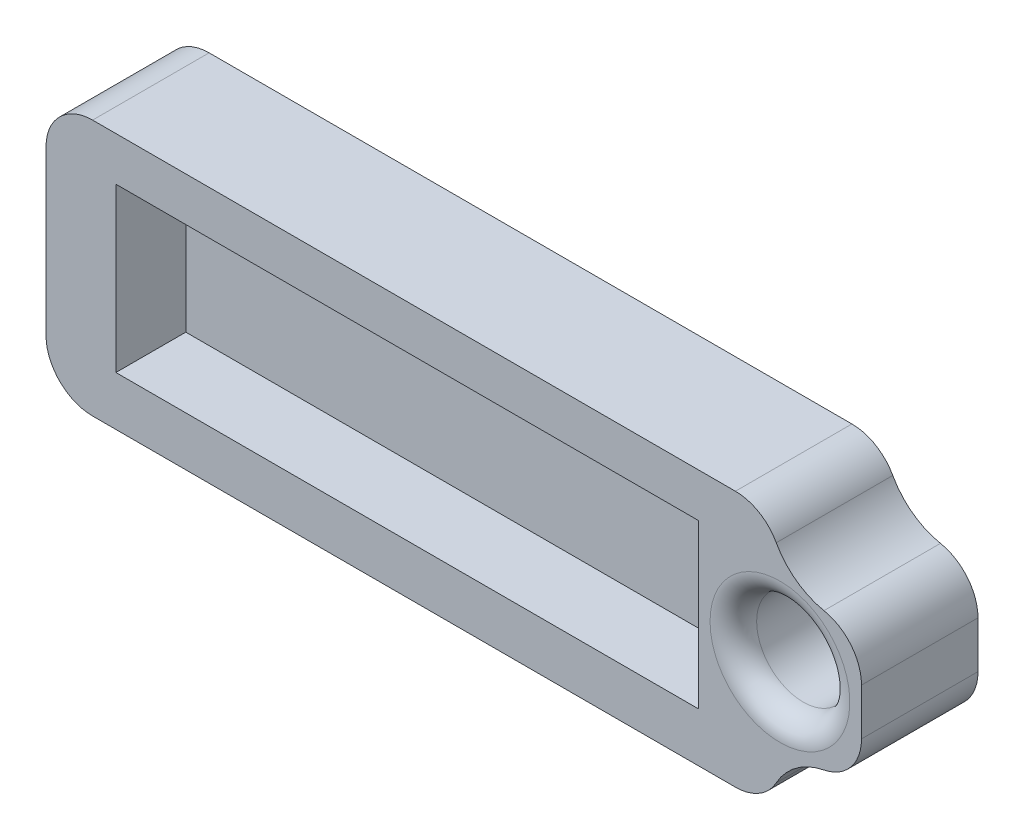
ISO-10303-21;
HEADER;
FILE_DESCRIPTION(('STEP AP214'),'2;1');
FILE_NAME('part.step','',(''),(''),'','','');
FILE_SCHEMA(('AUTOMOTIVE_DESIGN { 1 0 10303 214 1 1 1 1 }'));
ENDSEC;
DATA;
#1=APPLICATION_CONTEXT('core data for automotive mechanical design processes');
#2=APPLICATION_PROTOCOL_DEFINITION('international standard','automotive_design',2000,#1);
#3=PRODUCT_CONTEXT('',#1,'mechanical');
#4=PRODUCT('Part','Part','',(#3));
#5=PRODUCT_RELATED_PRODUCT_CATEGORY('part','',(#4));
#6=PRODUCT_DEFINITION_FORMATION('','',#4);
#7=PRODUCT_DEFINITION_CONTEXT('part definition',#1,'design');
#8=PRODUCT_DEFINITION('design','',#6,#7);
#9=PRODUCT_DEFINITION_SHAPE('','',#8);
#10=(LENGTH_UNIT() NAMED_UNIT(*) SI_UNIT(.MILLI.,.METRE.));
#11=(NAMED_UNIT(*) PLANE_ANGLE_UNIT() SI_UNIT($,.RADIAN.));
#12=(NAMED_UNIT(*) SI_UNIT($,.STERADIAN.) SOLID_ANGLE_UNIT());
#13=UNCERTAINTY_MEASURE_WITH_UNIT(LENGTH_MEASURE(1.E-05),#10,'distance_accuracy_value','');
#14=(GEOMETRIC_REPRESENTATION_CONTEXT(3) GLOBAL_UNCERTAINTY_ASSIGNED_CONTEXT((#13)) GLOBAL_UNIT_ASSIGNED_CONTEXT((#10,
#11,#12)) REPRESENTATION_CONTEXT('',''));
#15=CARTESIAN_POINT('',(0.,0.,0.));
#16=DIRECTION('',(0.,0.,1.));
#17=DIRECTION('',(1.,0.,0.));
#18=AXIS2_PLACEMENT_3D('',#15,#16,#17);
#19=CARTESIAN_POINT('',(-48.0962896326296,11.,-18.146412089834));
#20=DIRECTION('',(1.,0.,0.));
#21=DIRECTION('',(0.,0.,-1.));
#22=AXIS2_PLACEMENT_3D('',#19,#20,#21);
#23=PLANE('',#22);
#24=DIRECTION('',(0.,-1.,0.));
#25=VECTOR('',#24,1.);
#26=CARTESIAN_POINT('',(-48.0962896326296,11.,-18.146412089834));
#27=LINE('',#26,#25);
#28=CARTESIAN_POINT('',(-48.0962896326296,9.,-18.146412089834));
#29=VERTEX_POINT('',#28);
#30=CARTESIAN_POINT('',(-48.0962896326296,2.,-18.146412089834));
#31=VERTEX_POINT('',#30);
#32=EDGE_CURVE('E201',#29,#31,#27,.T.);
#33=ORIENTED_EDGE('',*,*,#32,.T.);
#34=DIRECTION('',(0.,0.,1.));
#35=VECTOR('',#34,1.);
#36=CARTESIAN_POINT('',(-48.0962896326296,2.,-18.146412089834));
#37=LINE('',#36,#35);
#38=CARTESIAN_POINT('',(-48.0962896326296,2.,-13.146412089834));
#39=VERTEX_POINT('',#38);
#40=EDGE_CURVE('E11',#31,#39,#37,.T.);
#41=ORIENTED_EDGE('',*,*,#40,.T.);
#42=DIRECTION('',(0.,-1.,0.));
#43=VECTOR('',#42,1.);
#44=CARTESIAN_POINT('',(-48.0962896326296,11.,-13.146412089834));
#45=LINE('',#44,#43);
#46=CARTESIAN_POINT('',(-48.0962896326296,9.,-13.146412089834));
#47=VERTEX_POINT('',#46);
#48=EDGE_CURVE('E207',#47,#39,#45,.T.);
#49=ORIENTED_EDGE('',*,*,#48,.F.);
#50=DIRECTION('',(0.,0.,1.));
#51=VECTOR('',#50,1.);
#52=CARTESIAN_POINT('',(-48.0962896326296,9.,-18.146412089834));
#53=LINE('',#52,#51);
#54=EDGE_CURVE('E41',#47,#29,#53,.F.);
#55=ORIENTED_EDGE('',*,*,#54,.T.);
#56=EDGE_LOOP('',(#33,#41,#49,#55));
#57=FACE_BOUND('',#56,.T.);
#58=ADVANCED_FACE('F33',(#57),#23,.F.);
#59=CARTESIAN_POINT('',(-48.0962896326296,11.,-13.146412089834));
#60=DIRECTION('',(0.,0.,-1.));
#61=DIRECTION('',(-1.,0.,0.));
#62=AXIS2_PLACEMENT_3D('',#59,#60,#61);
#63=PLANE('',#62);
#64=CARTESIAN_POINT('',(-16.5962896326296,5.61752243020169,-13.146412089834));
#65=DIRECTION('',(0.,0.,-1.));
#66=DIRECTION('',(-1.,0.,0.));
#67=AXIS2_PLACEMENT_3D('',#64,#65,#66);
#68=CIRCLE('',#67,3.);
#69=CARTESIAN_POINT('',(-19.5962896326296,5.61752243020169,-13.146412089834));
#70=VERTEX_POINT('',#69);
#71=EDGE_CURVE('E219',#70,#70,#68,.T.);
#72=ORIENTED_EDGE('',*,*,#71,.T.);
#73=EDGE_LOOP('',(#72));
#74=FACE_BOUND('',#73,.T.);
#75=DIRECTION('',(1.,0.,0.));
#76=VECTOR('',#75,1.);
#77=CARTESIAN_POINT('',(-20.0962896326296,2.11752243020169,-13.146412089834));
#78=LINE('',#77,#76);
#79=CARTESIAN_POINT('',(-45.0962896326296,2.11752243020169,-13.146412089834));
#80=VERTEX_POINT('',#79);
#81=CARTESIAN_POINT('',(-20.0962896326296,2.11752243020169,-13.146412089834));
#82=VERTEX_POINT('',#81);
#83=EDGE_CURVE('E184',#80,#82,#78,.T.);
#84=ORIENTED_EDGE('',*,*,#83,.F.);
#85=DIRECTION('',(0.,-1.,0.));
#86=VECTOR('',#85,1.);
#87=CARTESIAN_POINT('',(-45.0962896326296,2.11752243020169,-13.146412089834));
#88=LINE('',#87,#86);
#89=CARTESIAN_POINT('',(-45.0962896326296,9.11752243020169,-13.146412089834));
#90=VERTEX_POINT('',#89);
#91=EDGE_CURVE('E155',#90,#80,#88,.T.);
#92=ORIENTED_EDGE('',*,*,#91,.F.);
#93=DIRECTION('',(-1.,0.,0.));
#94=VECTOR('',#93,1.);
#95=CARTESIAN_POINT('',(-20.0962896326296,9.11752243020169,-13.146412089834));
#96=LINE('',#95,#94);
#97=CARTESIAN_POINT('',(-20.0962896326296,9.11752243020169,-13.146412089834));
#98=VERTEX_POINT('',#97);
#99=EDGE_CURVE('E172',#98,#90,#96,.T.);
#100=ORIENTED_EDGE('',*,*,#99,.F.);
#101=DIRECTION('',(0.,1.,0.));
#102=VECTOR('',#101,1.);
#103=CARTESIAN_POINT('',(-20.0962896326296,2.11752243020169,-13.146412089834));
#104=LINE('',#103,#102);
#105=EDGE_CURVE('E175',#82,#98,#104,.T.);
#106=ORIENTED_EDGE('',*,*,#105,.F.);
#107=EDGE_LOOP('',(#84,#92,#100,#106));
#108=FACE_BOUND('',#107,.T.);
#109=CARTESIAN_POINT('',(-14.1236836087987,11.4044915661471,-13.146412089834));
#110=DIRECTION('',(0.,0.,-1.));
#111=DIRECTION('',(-1.,0.,0.));
#112=AXIS2_PLACEMENT_3D('',#109,#110,#111);
#113=CIRCLE('',#112,3.);
#114=CARTESIAN_POINT('',(-14.7072472230972,8.46179662645883,-13.146412089834));
#115=VERTEX_POINT('',#114);
#116=CARTESIAN_POINT('',(-16.7540127347823,9.96179662645883,-13.146412089834));
#117=VERTEX_POINT('',#116);
#118=EDGE_CURVE('E244',#115,#117,#113,.T.);
#119=ORIENTED_EDGE('',*,*,#118,.T.);
#120=CARTESIAN_POINT('',(-18.5075654854381,9.,-13.146412089834));
#121=DIRECTION('',(0.,0.,-1.));
#122=DIRECTION('',(-1.,0.,0.));
#123=AXIS2_PLACEMENT_3D('',#120,#121,#122);
#124=CIRCLE('',#123,2.);
#125=CARTESIAN_POINT('',(-18.5075654854381,11.,-13.146412089834));
#126=VERTEX_POINT('',#125);
#127=EDGE_CURVE('E275',#117,#126,#124,.F.);
#128=ORIENTED_EDGE('',*,*,#127,.T.);
#129=DIRECTION('',(1.,0.,0.));
#130=VECTOR('',#129,1.);
#131=CARTESIAN_POINT('',(-48.0962896326296,11.,-13.146412089834));
#132=LINE('',#131,#130);
#133=CARTESIAN_POINT('',(-46.0962896326296,11.,-13.146412089834));
#134=VERTEX_POINT('',#133);
#135=EDGE_CURVE('E194',#134,#126,#132,.T.);
#136=ORIENTED_EDGE('',*,*,#135,.F.);
#137=CARTESIAN_POINT('',(-46.0962896326296,9.,-13.146412089834));
#138=DIRECTION('',(0.,0.,-1.));
#139=DIRECTION('',(-1.,0.,0.));
#140=AXIS2_PLACEMENT_3D('',#137,#138,#139);
#141=CIRCLE('',#140,2.);
#142=EDGE_CURVE('E270',#134,#47,#141,.F.);
#143=ORIENTED_EDGE('',*,*,#142,.T.);
#144=ORIENTED_EDGE('',*,*,#48,.T.);
#145=CARTESIAN_POINT('',(-46.0962896326296,2.,-13.146412089834));
#146=DIRECTION('',(0.,0.,-1.));
#147=DIRECTION('',(-1.,0.,0.));
#148=AXIS2_PLACEMENT_3D('',#145,#146,#147);
#149=CIRCLE('',#148,2.);
#150=CARTESIAN_POINT('',(-46.0962896326296,0.,-13.146412089834));
#151=VERTEX_POINT('',#150);
#152=EDGE_CURVE('E272',#39,#151,#149,.F.);
#153=ORIENTED_EDGE('',*,*,#152,.T.);
#154=DIRECTION('',(1.,0.,0.));
#155=VECTOR('',#154,1.);
#156=CARTESIAN_POINT('',(-48.0962896326296,0.,-13.146412089834));
#157=LINE('',#156,#155);
#158=CARTESIAN_POINT('',(-18.5075654854381,0.,-13.146412089834));
#159=VERTEX_POINT('',#158);
#160=EDGE_CURVE('E190',#151,#159,#157,.T.);
#161=ORIENTED_EDGE('',*,*,#160,.T.);
#162=CARTESIAN_POINT('',(-18.5075654854381,2.,-13.146412089834));
#163=DIRECTION('',(0.,0.,-1.));
#164=DIRECTION('',(-1.,0.,0.));
#165=AXIS2_PLACEMENT_3D('',#162,#163,#164);
#166=CIRCLE('',#165,2.);
#167=CARTESIAN_POINT('',(-16.7540127347823,1.03820337354117,-13.146412089834));
#168=VERTEX_POINT('',#167);
#169=EDGE_CURVE('E48',#159,#168,#166,.F.);
#170=ORIENTED_EDGE('',*,*,#169,.T.);
#171=CARTESIAN_POINT('',(-14.1236836087987,-0.404491566147076,-13.146412089834));
#172=DIRECTION('',(0.,0.,-1.));
#173=DIRECTION('',(-1.,0.,0.));
#174=AXIS2_PLACEMENT_3D('',#171,#172,#173);
#175=CIRCLE('',#174,3.);
#176=CARTESIAN_POINT('',(-14.7072472230972,2.53820337354117,-13.146412089834));
#177=VERTEX_POINT('',#176);
#178=EDGE_CURVE('E252',#168,#177,#175,.T.);
#179=ORIENTED_EDGE('',*,*,#178,.T.);
#180=CARTESIAN_POINT('',(-15.0962896326296,4.5,-13.146412089834));
#181=DIRECTION('',(0.,0.,-1.));
#182=DIRECTION('',(-1.,0.,0.));
#183=AXIS2_PLACEMENT_3D('',#180,#181,#182);
#184=CIRCLE('',#183,2.);
#185=CARTESIAN_POINT('',(-13.0962896326296,4.5,-13.146412089834));
#186=VERTEX_POINT('',#185);
#187=EDGE_CURVE('E228',#177,#186,#184,.F.);
#188=ORIENTED_EDGE('',*,*,#187,.T.);
#189=DIRECTION('',(0.,-1.,0.));
#190=VECTOR('',#189,1.);
#191=CARTESIAN_POINT('',(-13.0962896326296,2.5,-13.146412089834));
#192=LINE('',#191,#190);
#193=CARTESIAN_POINT('',(-13.0962896326296,6.5,-13.146412089834));
#194=VERTEX_POINT('',#193);
#195=EDGE_CURVE('E313',#194,#186,#192,.T.);
#196=ORIENTED_EDGE('',*,*,#195,.F.);
#197=CARTESIAN_POINT('',(-15.0962896326296,6.5,-13.146412089834));
#198=DIRECTION('',(0.,0.,-1.));
#199=DIRECTION('',(-1.,0.,0.));
#200=AXIS2_PLACEMENT_3D('',#197,#198,#199);
#201=CIRCLE('',#200,2.);
#202=EDGE_CURVE('E230',#194,#115,#201,.F.);
#203=ORIENTED_EDGE('',*,*,#202,.T.);
#204=EDGE_LOOP('',(#119,#128,#136,#143,#144,#153,#161,#170,#179,#188,#196,#203));
#205=FACE_BOUND('',#204,.T.);
#206=ADVANCED_FACE('F298',(#74,#108,#205),#63,.F.);
#207=CARTESIAN_POINT('',(-48.0962896326296,11.,-18.146412089834));
#208=DIRECTION('',(0.,0.,1.));
#209=DIRECTION('',(1.,0.,0.));
#210=AXIS2_PLACEMENT_3D('',#207,#208,#209);
#211=PLANE('',#210);
#212=CARTESIAN_POINT('',(-16.5962896326296,5.61752243020169,-18.146412089834));
#213=DIRECTION('',(0.,0.,1.));
#214=DIRECTION('',(1.,0.,0.));
#215=AXIS2_PLACEMENT_3D('',#212,#213,#214);
#216=CIRCLE('',#215,3.);
#217=CARTESIAN_POINT('',(-13.5962896326296,5.61752243020169,-18.146412089834));
#218=VERTEX_POINT('',#217);
#219=EDGE_CURVE('E210',#218,#218,#216,.T.);
#220=ORIENTED_EDGE('',*,*,#219,.T.);
#221=EDGE_LOOP('',(#220));
#222=FACE_BOUND('',#221,.T.);
#223=DIRECTION('',(-1.,0.,0.));
#224=VECTOR('',#223,1.);
#225=CARTESIAN_POINT('',(-48.0962896326296,11.,-18.146412089834));
#226=LINE('',#225,#224);
#227=CARTESIAN_POINT('',(-18.5075654854381,11.,-18.146412089834));
#228=VERTEX_POINT('',#227);
#229=CARTESIAN_POINT('',(-46.0962896326296,11.,-18.146412089834));
#230=VERTEX_POINT('',#229);
#231=EDGE_CURVE('E197',#228,#230,#226,.T.);
#232=ORIENTED_EDGE('',*,*,#231,.F.);
#233=CARTESIAN_POINT('',(-18.5075654854381,9.,-18.146412089834));
#234=DIRECTION('',(0.,0.,1.));
#235=DIRECTION('',(1.,0.,0.));
#236=AXIS2_PLACEMENT_3D('',#233,#234,#235);
#237=CIRCLE('',#236,2.);
#238=CARTESIAN_POINT('',(-16.7540127347823,9.96179662645883,-18.146412089834));
#239=VERTEX_POINT('',#238);
#240=EDGE_CURVE('E266',#228,#239,#237,.F.);
#241=ORIENTED_EDGE('',*,*,#240,.T.);
#242=CARTESIAN_POINT('',(-14.1236836087987,11.4044915661471,-18.146412089834));
#243=DIRECTION('',(0.,0.,1.));
#244=DIRECTION('',(1.,0.,0.));
#245=AXIS2_PLACEMENT_3D('',#242,#243,#244);
#246=CIRCLE('',#245,3.);
#247=CARTESIAN_POINT('',(-14.7072472230972,8.46179662645883,-18.146412089834));
#248=VERTEX_POINT('',#247);
#249=EDGE_CURVE('E247',#239,#248,#246,.T.);
#250=ORIENTED_EDGE('',*,*,#249,.T.);
#251=CARTESIAN_POINT('',(-15.0962896326296,6.5,-18.146412089834));
#252=DIRECTION('',(0.,0.,1.));
#253=DIRECTION('',(1.,0.,0.));
#254=AXIS2_PLACEMENT_3D('',#251,#252,#253);
#255=CIRCLE('',#254,2.);
#256=CARTESIAN_POINT('',(-13.0962896326296,6.5,-18.146412089834));
#257=VERTEX_POINT('',#256);
#258=EDGE_CURVE('E236',#248,#257,#255,.F.);
#259=ORIENTED_EDGE('',*,*,#258,.T.);
#260=DIRECTION('',(0.,1.,0.));
#261=VECTOR('',#260,1.);
#262=CARTESIAN_POINT('',(-13.0962896326296,2.5,-18.146412089834));
#263=LINE('',#262,#261);
#264=CARTESIAN_POINT('',(-13.0962896326296,4.5,-18.146412089834));
#265=VERTEX_POINT('',#264);
#266=EDGE_CURVE('E178',#265,#257,#263,.T.);
#267=ORIENTED_EDGE('',*,*,#266,.F.);
#268=CARTESIAN_POINT('',(-15.0962896326296,4.5,-18.146412089834));
#269=DIRECTION('',(0.,0.,1.));
#270=DIRECTION('',(1.,0.,0.));
#271=AXIS2_PLACEMENT_3D('',#268,#269,#270);
#272=CIRCLE('',#271,2.);
#273=CARTESIAN_POINT('',(-14.7072472230972,2.53820337354117,-18.146412089834));
#274=VERTEX_POINT('',#273);
#275=EDGE_CURVE('E233',#265,#274,#272,.F.);
#276=ORIENTED_EDGE('',*,*,#275,.T.);
#277=CARTESIAN_POINT('',(-14.1236836087987,-0.404491566147076,-18.146412089834));
#278=DIRECTION('',(0.,0.,1.));
#279=DIRECTION('',(1.,0.,0.));
#280=AXIS2_PLACEMENT_3D('',#277,#278,#279);
#281=CIRCLE('',#280,3.);
#282=CARTESIAN_POINT('',(-16.7540127347823,1.03820337354117,-18.146412089834));
#283=VERTEX_POINT('',#282);
#284=EDGE_CURVE('E249',#274,#283,#281,.T.);
#285=ORIENTED_EDGE('',*,*,#284,.T.);
#286=CARTESIAN_POINT('',(-18.5075654854381,2.,-18.146412089834));
#287=DIRECTION('',(0.,0.,1.));
#288=DIRECTION('',(1.,0.,0.));
#289=AXIS2_PLACEMENT_3D('',#286,#287,#288);
#290=CIRCLE('',#289,2.);
#291=CARTESIAN_POINT('',(-18.5075654854381,0.,-18.146412089834));
#292=VERTEX_POINT('',#291);
#293=EDGE_CURVE('E264',#283,#292,#290,.F.);
#294=ORIENTED_EDGE('',*,*,#293,.T.);
#295=DIRECTION('',(-1.,0.,0.));
#296=VECTOR('',#295,1.);
#297=CARTESIAN_POINT('',(-48.0962896326296,0.,-18.146412089834));
#298=LINE('',#297,#296);
#299=CARTESIAN_POINT('',(-46.0962896326296,0.,-18.146412089834));
#300=VERTEX_POINT('',#299);
#301=EDGE_CURVE('E198',#292,#300,#298,.T.);
#302=ORIENTED_EDGE('',*,*,#301,.T.);
#303=CARTESIAN_POINT('',(-46.0962896326296,2.,-18.146412089834));
#304=DIRECTION('',(0.,0.,1.));
#305=DIRECTION('',(1.,0.,0.));
#306=AXIS2_PLACEMENT_3D('',#303,#304,#305);
#307=CIRCLE('',#306,2.);
#308=EDGE_CURVE('E262',#300,#31,#307,.F.);
#309=ORIENTED_EDGE('',*,*,#308,.T.);
#310=ORIENTED_EDGE('',*,*,#32,.F.);
#311=CARTESIAN_POINT('',(-46.0962896326296,9.,-18.146412089834));
#312=DIRECTION('',(0.,0.,1.));
#313=DIRECTION('',(1.,0.,0.));
#314=AXIS2_PLACEMENT_3D('',#311,#312,#313);
#315=CIRCLE('',#314,2.);
#316=EDGE_CURVE('E260',#29,#230,#315,.F.);
#317=ORIENTED_EDGE('',*,*,#316,.T.);
#318=EDGE_LOOP('',(#232,#241,#250,#259,#267,#276,#285,#294,#302,#309,#310,#317));
#319=FACE_BOUND('',#318,.T.);
#320=ADVANCED_FACE('F291',(#222,#319),#211,.F.);
#321=CARTESIAN_POINT('',(0.,11.,0.));
#322=DIRECTION('',(0.,1.,0.));
#323=DIRECTION('',(0.,0.,1.));
#324=AXIS2_PLACEMENT_3D('',#321,#322,#323);
#325=PLANE('',#324);
#326=ORIENTED_EDGE('',*,*,#135,.T.);
#327=DIRECTION('',(0.,0.,1.));
#328=VECTOR('',#327,1.);
#329=CARTESIAN_POINT('',(-18.5075654854381,11.,-18.146412089834));
#330=LINE('',#329,#328);
#331=EDGE_CURVE('E257',#126,#228,#330,.F.);
#332=ORIENTED_EDGE('',*,*,#331,.T.);
#333=ORIENTED_EDGE('',*,*,#231,.T.);
#334=DIRECTION('',(0.,0.,1.));
#335=VECTOR('',#334,1.);
#336=CARTESIAN_POINT('',(-46.0962896326296,11.,-13.146412089834));
#337=LINE('',#336,#335);
#338=EDGE_CURVE('E254',#230,#134,#337,.T.);
#339=ORIENTED_EDGE('',*,*,#338,.T.);
#340=EDGE_LOOP('',(#326,#332,#333,#339));
#341=FACE_BOUND('',#340,.T.);
#342=ADVANCED_FACE('F296',(#341),#325,.T.);
#343=CARTESIAN_POINT('',(0.,0.,0.));
#344=DIRECTION('',(0.,1.,0.));
#345=DIRECTION('',(0.,0.,1.));
#346=AXIS2_PLACEMENT_3D('',#343,#344,#345);
#347=PLANE('',#346);
#348=ORIENTED_EDGE('',*,*,#301,.F.);
#349=DIRECTION('',(0.,0.,1.));
#350=VECTOR('',#349,1.);
#351=CARTESIAN_POINT('',(-18.5075654854381,0.,0.));
#352=LINE('',#351,#350);
#353=EDGE_CURVE('E56',#292,#159,#352,.T.);
#354=ORIENTED_EDGE('',*,*,#353,.T.);
#355=ORIENTED_EDGE('',*,*,#160,.F.);
#356=DIRECTION('',(0.,0.,1.));
#357=VECTOR('',#356,1.);
#358=CARTESIAN_POINT('',(-46.0962896326296,0.,0.));
#359=LINE('',#358,#357);
#360=EDGE_CURVE('E280',#151,#300,#359,.F.);
#361=ORIENTED_EDGE('',*,*,#360,.T.);
#362=EDGE_LOOP('',(#348,#354,#355,#361));
#363=FACE_BOUND('',#362,.T.);
#364=ADVANCED_FACE('F328',(#363),#347,.F.);
#365=CARTESIAN_POINT('',(-45.0962896326296,2.11752243020169,-16.146412089834));
#366=DIRECTION('',(-1.,0.,0.));
#367=DIRECTION('',(0.,0.,1.));
#368=AXIS2_PLACEMENT_3D('',#365,#366,#367);
#369=PLANE('',#368);
#370=ORIENTED_EDGE('',*,*,#91,.T.);
#371=DIRECTION('',(0.,0.,1.));
#372=VECTOR('',#371,1.);
#373=CARTESIAN_POINT('',(-45.0962896326296,2.11752243020169,-16.146412089834));
#374=LINE('',#373,#372);
#375=CARTESIAN_POINT('',(-45.0962896326296,2.11752243020169,-16.146412089834));
#376=VERTEX_POINT('',#375);
#377=EDGE_CURVE('E148',#376,#80,#374,.T.);
#378=ORIENTED_EDGE('',*,*,#377,.F.);
#379=DIRECTION('',(0.,-1.,0.));
#380=VECTOR('',#379,1.);
#381=CARTESIAN_POINT('',(-45.0962896326296,2.11752243020169,-16.146412089834));
#382=LINE('',#381,#380);
#383=CARTESIAN_POINT('',(-45.0962896326296,9.11752243020169,-16.146412089834));
#384=VERTEX_POINT('',#383);
#385=EDGE_CURVE('E152',#384,#376,#382,.T.);
#386=ORIENTED_EDGE('',*,*,#385,.F.);
#387=DIRECTION('',(0.,0.,1.));
#388=VECTOR('',#387,1.);
#389=CARTESIAN_POINT('',(-45.0962896326296,9.11752243020169,-16.146412089834));
#390=LINE('',#389,#388);
#391=EDGE_CURVE('E188',#384,#90,#390,.T.);
#392=ORIENTED_EDGE('',*,*,#391,.T.);
#393=EDGE_LOOP('',(#370,#378,#386,#392));
#394=FACE_BOUND('',#393,.T.);
#395=ADVANCED_FACE('F150',(#394),#369,.F.);
#396=CARTESIAN_POINT('',(-20.0962896326296,9.11752243020169,-16.146412089834));
#397=DIRECTION('',(0.,1.,0.));
#398=DIRECTION('',(-1.,0.,0.));
#399=AXIS2_PLACEMENT_3D('',#396,#397,#398);
#400=PLANE('',#399);
#401=ORIENTED_EDGE('',*,*,#99,.T.);
#402=ORIENTED_EDGE('',*,*,#391,.F.);
#403=DIRECTION('',(-1.,0.,0.));
#404=VECTOR('',#403,1.);
#405=CARTESIAN_POINT('',(-20.0962896326296,9.11752243020169,-16.146412089834));
#406=LINE('',#405,#404);
#407=CARTESIAN_POINT('',(-20.0962896326296,9.11752243020169,-16.146412089834));
#408=VERTEX_POINT('',#407);
#409=EDGE_CURVE('E160',#408,#384,#406,.T.);
#410=ORIENTED_EDGE('',*,*,#409,.F.);
#411=DIRECTION('',(0.,0.,1.));
#412=VECTOR('',#411,1.);
#413=CARTESIAN_POINT('',(-20.0962896326296,9.11752243020169,-16.146412089834));
#414=LINE('',#413,#412);
#415=EDGE_CURVE('E191',#408,#98,#414,.T.);
#416=ORIENTED_EDGE('',*,*,#415,.T.);
#417=EDGE_LOOP('',(#401,#402,#410,#416));
#418=FACE_BOUND('',#417,.T.);
#419=ADVANCED_FACE('F476',(#418),#400,.F.);
#420=CARTESIAN_POINT('',(-20.0962896326296,2.11752243020169,-16.146412089834));
#421=DIRECTION('',(1.,0.,0.));
#422=DIRECTION('',(0.,0.,-1.));
#423=AXIS2_PLACEMENT_3D('',#420,#421,#422);
#424=PLANE('',#423);
#425=ORIENTED_EDGE('',*,*,#105,.T.);
#426=ORIENTED_EDGE('',*,*,#415,.F.);
#427=DIRECTION('',(0.,1.,0.));
#428=VECTOR('',#427,1.);
#429=CARTESIAN_POINT('',(-20.0962896326296,2.11752243020169,-16.146412089834));
#430=LINE('',#429,#428);
#431=CARTESIAN_POINT('',(-20.0962896326296,2.11752243020169,-16.146412089834));
#432=VERTEX_POINT('',#431);
#433=EDGE_CURVE('E168',#432,#408,#430,.T.);
#434=ORIENTED_EDGE('',*,*,#433,.F.);
#435=DIRECTION('',(0.,0.,1.));
#436=VECTOR('',#435,1.);
#437=CARTESIAN_POINT('',(-20.0962896326296,2.11752243020169,-16.146412089834));
#438=LINE('',#437,#436);
#439=EDGE_CURVE('E159',#432,#82,#438,.T.);
#440=ORIENTED_EDGE('',*,*,#439,.T.);
#441=EDGE_LOOP('',(#425,#426,#434,#440));
#442=FACE_BOUND('',#441,.T.);
#443=ADVANCED_FACE('F468',(#442),#424,.F.);
#444=CARTESIAN_POINT('',(-20.0962896326296,2.11752243020169,-16.146412089834));
#445=DIRECTION('',(0.,-1.,0.));
#446=DIRECTION('',(1.,0.,0.));
#447=AXIS2_PLACEMENT_3D('',#444,#445,#446);
#448=PLANE('',#447);
#449=ORIENTED_EDGE('',*,*,#83,.T.);
#450=ORIENTED_EDGE('',*,*,#439,.F.);
#451=DIRECTION('',(1.,0.,0.));
#452=VECTOR('',#451,1.);
#453=CARTESIAN_POINT('',(-20.0962896326296,2.11752243020169,-16.146412089834));
#454=LINE('',#453,#452);
#455=EDGE_CURVE('E163',#376,#432,#454,.T.);
#456=ORIENTED_EDGE('',*,*,#455,.F.);
#457=ORIENTED_EDGE('',*,*,#377,.T.);
#458=EDGE_LOOP('',(#449,#450,#456,#457));
#459=FACE_BOUND('',#458,.T.);
#460=ADVANCED_FACE('F164',(#459),#448,.F.);
#461=CARTESIAN_POINT('',(0.,0.,-16.146412089834));
#462=DIRECTION('',(0.,0.,1.));
#463=DIRECTION('',(1.,0.,0.));
#464=AXIS2_PLACEMENT_3D('',#461,#462,#463);
#465=PLANE('',#464);
#466=ORIENTED_EDGE('',*,*,#385,.T.);
#467=ORIENTED_EDGE('',*,*,#455,.T.);
#468=ORIENTED_EDGE('',*,*,#433,.T.);
#469=ORIENTED_EDGE('',*,*,#409,.T.);
#470=EDGE_LOOP('',(#466,#467,#468,#469));
#471=FACE_BOUND('',#470,.T.);
#472=ADVANCED_FACE('F170',(#471),#465,.T.);
#473=CARTESIAN_POINT('',(-13.0962896326296,0.,0.));
#474=DIRECTION('',(1.,0.,0.));
#475=DIRECTION('',(0.,0.,-1.));
#476=AXIS2_PLACEMENT_3D('',#473,#474,#475);
#477=PLANE('',#476);
#478=ORIENTED_EDGE('',*,*,#266,.T.);
#479=DIRECTION('',(0.,0.,1.));
#480=VECTOR('',#479,1.);
#481=CARTESIAN_POINT('',(-13.0962896326296,6.5,-13.146412089834));
#482=LINE('',#481,#480);
#483=EDGE_CURVE('E225',#257,#194,#482,.T.);
#484=ORIENTED_EDGE('',*,*,#483,.T.);
#485=ORIENTED_EDGE('',*,*,#195,.T.);
#486=DIRECTION('',(0.,0.,-1.));
#487=VECTOR('',#486,1.);
#488=CARTESIAN_POINT('',(-13.0962896326296,4.5,-18.146412089834));
#489=LINE('',#488,#487);
#490=EDGE_CURVE('E222',#186,#265,#489,.T.);
#491=ORIENTED_EDGE('',*,*,#490,.T.);
#492=EDGE_LOOP('',(#478,#484,#485,#491));
#493=FACE_BOUND('',#492,.T.);
#494=ADVANCED_FACE('F319',(#493),#477,.T.);
#495=CARTESIAN_POINT('',(-16.5962896326296,5.61752243020169,-18.146462089834));
#496=DIRECTION('',(0.,0.,1.));
#497=DIRECTION('',(1.,0.,0.));
#498=AXIS2_PLACEMENT_3D('',#495,#496,#497);
#499=CYLINDRICAL_SURFACE('',#498,2.);
#500=CARTESIAN_POINT('',(-16.5962896326296,5.61752243020169,-17.146412089834));
#501=DIRECTION('',(0.,0.,1.));
#502=DIRECTION('',(1.,0.,0.));
#503=AXIS2_PLACEMENT_3D('',#500,#501,#502);
#504=CIRCLE('',#503,2.);
#505=CARTESIAN_POINT('',(-14.5962896326296,5.61752243020169,-17.146412089834));
#506=VERTEX_POINT('',#505);
#507=EDGE_CURVE('E216',#506,#506,#504,.F.);
#508=ORIENTED_EDGE('',*,*,#507,.T.);
#509=EDGE_LOOP('',(#508));
#510=FACE_BOUND('',#509,.T.);
#511=CARTESIAN_POINT('',(-16.5962896326296,5.61752243020169,-14.146412089834));
#512=DIRECTION('',(0.,0.,-1.));
#513=DIRECTION('',(-1.,0.,0.));
#514=AXIS2_PLACEMENT_3D('',#511,#512,#513);
#515=CIRCLE('',#514,2.);
#516=CARTESIAN_POINT('',(-18.5962896326296,5.61752243020169,-14.146412089834));
#517=VERTEX_POINT('',#516);
#518=EDGE_CURVE('E213',#517,#517,#515,.F.);
#519=ORIENTED_EDGE('',*,*,#518,.T.);
#520=EDGE_LOOP('',(#519));
#521=FACE_BOUND('',#520,.T.);
#522=ADVANCED_FACE('F351',(#510,#521),#499,.F.);
#523=CARTESIAN_POINT('',(-16.5962896326296,5.61752243020169,-17.146412089834));
#524=DIRECTION('',(0.,0.,1.));
#525=DIRECTION('',(1.,0.,0.));
#526=AXIS2_PLACEMENT_3D('',#523,#524,#525);
#527=TOROIDAL_SURFACE('',#526,3.,1.);
#528=ORIENTED_EDGE('',*,*,#507,.F.);
#529=EDGE_LOOP('',(#528));
#530=FACE_BOUND('',#529,.T.);
#531=ORIENTED_EDGE('',*,*,#219,.F.);
#532=EDGE_LOOP('',(#531));
#533=FACE_BOUND('',#532,.T.);
#534=ADVANCED_FACE('F347',(#530,#533),#527,.T.);
#535=CARTESIAN_POINT('',(-16.5962896326296,5.61752243020169,-14.146412089834));
#536=DIRECTION('',(0.,0.,-1.));
#537=DIRECTION('',(-1.,0.,0.));
#538=AXIS2_PLACEMENT_3D('',#535,#536,#537);
#539=TOROIDAL_SURFACE('',#538,3.,1.);
#540=ORIENTED_EDGE('',*,*,#71,.F.);
#541=EDGE_LOOP('',(#540));
#542=FACE_BOUND('',#541,.T.);
#543=ORIENTED_EDGE('',*,*,#518,.F.);
#544=EDGE_LOOP('',(#543));
#545=FACE_BOUND('',#544,.T.);
#546=ADVANCED_FACE('F350',(#542,#545),#539,.T.);
#547=CARTESIAN_POINT('',(-15.0962896326296,6.5,0.));
#548=DIRECTION('',(0.,0.,-1.));
#549=DIRECTION('',(-1.,0.,0.));
#550=AXIS2_PLACEMENT_3D('',#547,#548,#549);
#551=CYLINDRICAL_SURFACE('',#550,2.);
#552=ORIENTED_EDGE('',*,*,#258,.F.);
#553=DIRECTION('',(0.,0.,-1.));
#554=VECTOR('',#553,1.);
#555=CARTESIAN_POINT('',(-14.7072472230972,8.46179662645883,0.));
#556=LINE('',#555,#554);
#557=EDGE_CURVE('E238',#248,#115,#556,.F.);
#558=ORIENTED_EDGE('',*,*,#557,.T.);
#559=ORIENTED_EDGE('',*,*,#202,.F.);
#560=ORIENTED_EDGE('',*,*,#483,.F.);
#561=EDGE_LOOP('',(#552,#558,#559,#560));
#562=FACE_BOUND('',#561,.T.);
#563=ADVANCED_FACE('F309',(#562),#551,.T.);
#564=CARTESIAN_POINT('',(-15.0962896326296,4.5,0.));
#565=DIRECTION('',(0.,0.,1.));
#566=DIRECTION('',(1.,0.,0.));
#567=AXIS2_PLACEMENT_3D('',#564,#565,#566);
#568=CYLINDRICAL_SURFACE('',#567,2.);
#569=ORIENTED_EDGE('',*,*,#187,.F.);
#570=DIRECTION('',(0.,0.,1.));
#571=VECTOR('',#570,1.);
#572=CARTESIAN_POINT('',(-14.7072472230972,2.53820337354117,0.));
#573=LINE('',#572,#571);
#574=EDGE_CURVE('E241',#177,#274,#573,.F.);
#575=ORIENTED_EDGE('',*,*,#574,.T.);
#576=ORIENTED_EDGE('',*,*,#275,.F.);
#577=ORIENTED_EDGE('',*,*,#490,.F.);
#578=EDGE_LOOP('',(#569,#575,#576,#577));
#579=FACE_BOUND('',#578,.T.);
#580=ADVANCED_FACE('F321',(#579),#568,.T.);
#581=CARTESIAN_POINT('',(-14.1236836087987,11.4044915661471,-18.146412089834));
#582=DIRECTION('',(0.,0.,-1.));
#583=DIRECTION('',(-1.,0.,0.));
#584=AXIS2_PLACEMENT_3D('',#581,#582,#583);
#585=CYLINDRICAL_SURFACE('',#584,3.);
#586=ORIENTED_EDGE('',*,*,#249,.F.);
#587=DIRECTION('',(0.,0.,-1.));
#588=VECTOR('',#587,1.);
#589=CARTESIAN_POINT('',(-16.7540127347823,9.96179662645883,-18.146412089834));
#590=LINE('',#589,#588);
#591=EDGE_CURVE('E268',#239,#117,#590,.F.);
#592=ORIENTED_EDGE('',*,*,#591,.T.);
#593=ORIENTED_EDGE('',*,*,#118,.F.);
#594=ORIENTED_EDGE('',*,*,#557,.F.);
#595=EDGE_LOOP('',(#586,#592,#593,#594));
#596=FACE_BOUND('',#595,.T.);
#597=ADVANCED_FACE('F307',(#596),#585,.F.);
#598=CARTESIAN_POINT('',(-14.1236836087987,-0.404491566147076,-18.146412089834));
#599=DIRECTION('',(0.,0.,1.));
#600=DIRECTION('',(1.,0.,0.));
#601=AXIS2_PLACEMENT_3D('',#598,#599,#600);
#602=CYLINDRICAL_SURFACE('',#601,3.);
#603=ORIENTED_EDGE('',*,*,#178,.F.);
#604=DIRECTION('',(0.,0.,1.));
#605=VECTOR('',#604,1.);
#606=CARTESIAN_POINT('',(-16.7540127347823,1.03820337354117,-18.146412089834));
#607=LINE('',#606,#605);
#608=EDGE_CURVE('E277',#168,#283,#607,.F.);
#609=ORIENTED_EDGE('',*,*,#608,.T.);
#610=ORIENTED_EDGE('',*,*,#284,.F.);
#611=ORIENTED_EDGE('',*,*,#574,.F.);
#612=EDGE_LOOP('',(#603,#609,#610,#611));
#613=FACE_BOUND('',#612,.T.);
#614=ADVANCED_FACE('F324',(#613),#602,.F.);
#615=CARTESIAN_POINT('',(-18.5075654854381,9.,-18.146412089834));
#616=DIRECTION('',(0.,0.,-1.));
#617=DIRECTION('',(-1.,0.,0.));
#618=AXIS2_PLACEMENT_3D('',#615,#616,#617);
#619=CYLINDRICAL_SURFACE('',#618,2.);
#620=ORIENTED_EDGE('',*,*,#127,.F.);
#621=ORIENTED_EDGE('',*,*,#591,.F.);
#622=ORIENTED_EDGE('',*,*,#240,.F.);
#623=ORIENTED_EDGE('',*,*,#331,.F.);
#624=EDGE_LOOP('',(#620,#621,#622,#623));
#625=FACE_BOUND('',#624,.T.);
#626=ADVANCED_FACE('F302',(#625),#619,.T.);
#627=CARTESIAN_POINT('',(-18.5075654854381,2.,-18.146412089834));
#628=DIRECTION('',(0.,0.,1.));
#629=DIRECTION('',(1.,0.,0.));
#630=AXIS2_PLACEMENT_3D('',#627,#628,#629);
#631=CYLINDRICAL_SURFACE('',#630,2.);
#632=ORIENTED_EDGE('',*,*,#169,.F.);
#633=ORIENTED_EDGE('',*,*,#353,.F.);
#634=ORIENTED_EDGE('',*,*,#293,.F.);
#635=ORIENTED_EDGE('',*,*,#608,.F.);
#636=EDGE_LOOP('',(#632,#633,#634,#635));
#637=FACE_BOUND('',#636,.T.);
#638=ADVANCED_FACE('F327',(#637),#631,.T.);
#639=CARTESIAN_POINT('',(-46.0962896326296,2.,-18.146412089834));
#640=DIRECTION('',(0.,0.,1.));
#641=DIRECTION('',(1.,0.,0.));
#642=AXIS2_PLACEMENT_3D('',#639,#640,#641);
#643=CYLINDRICAL_SURFACE('',#642,2.);
#644=ORIENTED_EDGE('',*,*,#308,.F.);
#645=ORIENTED_EDGE('',*,*,#360,.F.);
#646=ORIENTED_EDGE('',*,*,#152,.F.);
#647=ORIENTED_EDGE('',*,*,#40,.F.);
#648=EDGE_LOOP('',(#644,#645,#646,#647));
#649=FACE_BOUND('',#648,.T.);
#650=ADVANCED_FACE('F331',(#649),#643,.T.);
#651=CARTESIAN_POINT('',(-46.0962896326296,9.,0.));
#652=DIRECTION('',(0.,0.,-1.));
#653=DIRECTION('',(-1.,0.,0.));
#654=AXIS2_PLACEMENT_3D('',#651,#652,#653);
#655=CYLINDRICAL_SURFACE('',#654,2.);
#656=ORIENTED_EDGE('',*,*,#316,.F.);
#657=ORIENTED_EDGE('',*,*,#54,.F.);
#658=ORIENTED_EDGE('',*,*,#142,.F.);
#659=ORIENTED_EDGE('',*,*,#338,.F.);
#660=EDGE_LOOP('',(#656,#657,#658,#659));
#661=FACE_BOUND('',#660,.T.);
#662=ADVANCED_FACE('F35',(#661),#655,.T.);
#663=CLOSED_SHELL('',(#58,#206,#320,#342,#364,#395,#419,#443,#460,#472,#494,#522,#534,#546,#563,
#580,#597,#614,#626,#638,#650,#662));
#664=MANIFOLD_SOLID_BREP('B2',#663);
#665=ADVANCED_BREP_SHAPE_REPRESENTATION('',(#18,#664),#14);
#666=SHAPE_DEFINITION_REPRESENTATION(#9,#665);
ENDSEC;
END-ISO-10303-21;
